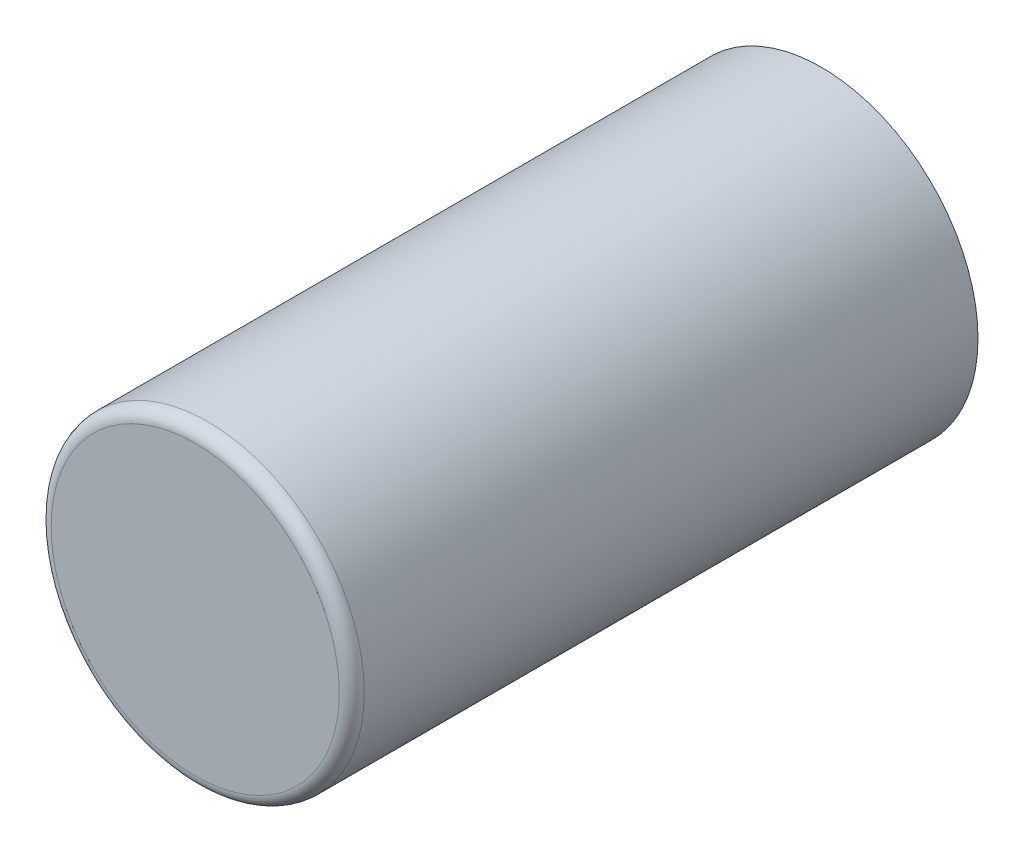
ISO-10303-21;
HEADER;
FILE_DESCRIPTION(('STEP AP214'),'2;1');
FILE_NAME('part.step','',(''),(''),'','','');
FILE_SCHEMA(('AUTOMOTIVE_DESIGN { 1 0 10303 214 1 1 1 1 }'));
ENDSEC;
DATA;
#1=APPLICATION_CONTEXT('core data for automotive mechanical design processes');
#2=APPLICATION_PROTOCOL_DEFINITION('international standard','automotive_design',2000,#1);
#3=PRODUCT_CONTEXT('',#1,'mechanical');
#4=PRODUCT('Part','Part','',(#3));
#5=PRODUCT_RELATED_PRODUCT_CATEGORY('part','',(#4));
#6=PRODUCT_DEFINITION_FORMATION('','',#4);
#7=PRODUCT_DEFINITION_CONTEXT('part definition',#1,'design');
#8=PRODUCT_DEFINITION('design','',#6,#7);
#9=PRODUCT_DEFINITION_SHAPE('','',#8);
#10=(LENGTH_UNIT() NAMED_UNIT(*) SI_UNIT(.MILLI.,.METRE.));
#11=(NAMED_UNIT(*) PLANE_ANGLE_UNIT() SI_UNIT($,.RADIAN.));
#12=(NAMED_UNIT(*) SI_UNIT($,.STERADIAN.) SOLID_ANGLE_UNIT());
#13=UNCERTAINTY_MEASURE_WITH_UNIT(LENGTH_MEASURE(1.E-05),#10,'distance_accuracy_value','');
#14=(GEOMETRIC_REPRESENTATION_CONTEXT(3) GLOBAL_UNCERTAINTY_ASSIGNED_CONTEXT((#13)) GLOBAL_UNIT_ASSIGNED_CONTEXT((#10,
#11,#12)) REPRESENTATION_CONTEXT('',''));
#15=CARTESIAN_POINT('',(0.,0.,0.));
#16=DIRECTION('',(0.,0.,1.));
#17=DIRECTION('',(1.,0.,0.));
#18=AXIS2_PLACEMENT_3D('',#15,#16,#17);
#19=CARTESIAN_POINT('',(0.,0.,100.));
#20=DIRECTION('',(0.,0.,-1.));
#21=DIRECTION('',(-1.,0.,0.));
#22=AXIS2_PLACEMENT_3D('',#19,#20,#21);
#23=CYLINDRICAL_SURFACE('',#22,25.);
#24=CARTESIAN_POINT('',(0.,0.,98.));
#25=DIRECTION('',(0.,0.,1.));
#26=DIRECTION('',(1.,0.,0.));
#27=AXIS2_PLACEMENT_3D('',#24,#25,#26);
#28=CIRCLE('',#27,25.);
#29=CARTESIAN_POINT('',(25.,0.,98.));
#30=VERTEX_POINT('',#29);
#31=EDGE_CURVE('E10',#30,#30,#28,.F.);
#32=ORIENTED_EDGE('',*,*,#31,.T.);
#33=EDGE_LOOP('',(#32));
#34=FACE_BOUND('',#33,.T.);
#35=CARTESIAN_POINT('',(0.,0.,0.));
#36=DIRECTION('',(0.,0.,1.));
#37=DIRECTION('',(1.,0.,0.));
#38=AXIS2_PLACEMENT_3D('',#35,#36,#37);
#39=CIRCLE('',#38,25.);
#40=CARTESIAN_POINT('',(25.,0.,0.));
#41=VERTEX_POINT('',#40);
#42=EDGE_CURVE('E46',#41,#41,#39,.T.);
#43=ORIENTED_EDGE('',*,*,#42,.T.);
#44=EDGE_LOOP('',(#43));
#45=FACE_BOUND('',#44,.T.);
#46=ADVANCED_FACE('F35',(#34,#45),#23,.T.);
#47=CARTESIAN_POINT('',(0.,0.,100.));
#48=DIRECTION('',(0.,0.,1.));
#49=DIRECTION('',(1.,0.,0.));
#50=AXIS2_PLACEMENT_3D('',#47,#48,#49);
#51=PLANE('',#50);
#52=CARTESIAN_POINT('',(0.,0.,100.));
#53=DIRECTION('',(0.,0.,1.));
#54=DIRECTION('',(1.,0.,0.));
#55=AXIS2_PLACEMENT_3D('',#52,#53,#54);
#56=CIRCLE('',#55,23.);
#57=CARTESIAN_POINT('',(23.,0.,100.));
#58=VERTEX_POINT('',#57);
#59=EDGE_CURVE('E42',#58,#58,#56,.T.);
#60=ORIENTED_EDGE('',*,*,#59,.T.);
#61=EDGE_LOOP('',(#60));
#62=FACE_BOUND('',#61,.T.);
#63=ADVANCED_FACE('F56',(#62),#51,.T.);
#64=CARTESIAN_POINT('',(0.,0.,0.));
#65=DIRECTION('',(0.,0.,1.));
#66=DIRECTION('',(1.,0.,0.));
#67=AXIS2_PLACEMENT_3D('',#64,#65,#66);
#68=PLANE('',#67);
#69=ORIENTED_EDGE('',*,*,#42,.F.);
#70=EDGE_LOOP('',(#69));
#71=FACE_BOUND('',#70,.T.);
#72=ADVANCED_FACE('F54',(#71),#68,.F.);
#73=CARTESIAN_POINT('',(0.,0.,98.));
#74=DIRECTION('',(0.,0.,1.));
#75=DIRECTION('',(1.,0.,0.));
#76=AXIS2_PLACEMENT_3D('',#73,#74,#75);
#77=TOROIDAL_SURFACE('',#76,23.,2.);
#78=ORIENTED_EDGE('',*,*,#31,.F.);
#79=EDGE_LOOP('',(#78));
#80=FACE_BOUND('',#79,.T.);
#81=ORIENTED_EDGE('',*,*,#59,.F.);
#82=EDGE_LOOP('',(#81));
#83=FACE_BOUND('',#82,.T.);
#84=ADVANCED_FACE('F37',(#80,#83),#77,.T.);
#85=CLOSED_SHELL('',(#46,#63,#72,#84));
#86=MANIFOLD_SOLID_BREP('B2',#85);
#87=ADVANCED_BREP_SHAPE_REPRESENTATION('',(#18,#86),#14);
#88=SHAPE_DEFINITION_REPRESENTATION(#9,#87);
ENDSEC;
END-ISO-10303-21;
